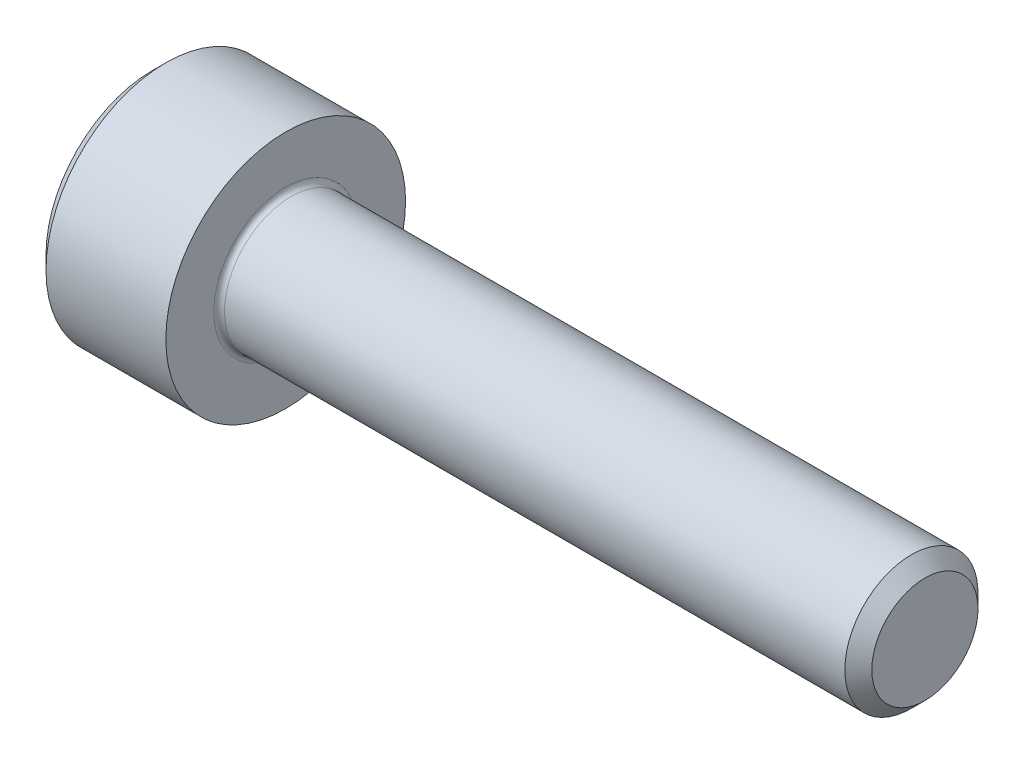
ISO-10303-21;
HEADER;
FILE_DESCRIPTION(('STEP AP214'),'2;1');
FILE_NAME('part.step','',(''),(''),'','','');
FILE_SCHEMA(('AUTOMOTIVE_DESIGN { 1 0 10303 214 1 1 1 1 }'));
ENDSEC;
DATA;
#1=APPLICATION_CONTEXT('core data for automotive mechanical design processes');
#2=APPLICATION_PROTOCOL_DEFINITION('international standard','automotive_design',2000,#1);
#3=PRODUCT_CONTEXT('',#1,'mechanical');
#4=PRODUCT('Part','Part','',(#3));
#5=PRODUCT_RELATED_PRODUCT_CATEGORY('part','',(#4));
#6=PRODUCT_DEFINITION_FORMATION('','',#4);
#7=PRODUCT_DEFINITION_CONTEXT('part definition',#1,'design');
#8=PRODUCT_DEFINITION('design','',#6,#7);
#9=PRODUCT_DEFINITION_SHAPE('','',#8);
#10=(LENGTH_UNIT() NAMED_UNIT(*) SI_UNIT(.MILLI.,.METRE.));
#11=(NAMED_UNIT(*) PLANE_ANGLE_UNIT() SI_UNIT($,.RADIAN.));
#12=(NAMED_UNIT(*) SI_UNIT($,.STERADIAN.) SOLID_ANGLE_UNIT());
#13=UNCERTAINTY_MEASURE_WITH_UNIT(LENGTH_MEASURE(1.E-05),#10,'distance_accuracy_value','');
#14=(GEOMETRIC_REPRESENTATION_CONTEXT(3) GLOBAL_UNCERTAINTY_ASSIGNED_CONTEXT((#13)) GLOBAL_UNIT_ASSIGNED_CONTEXT((#10,
#11,#12)) REPRESENTATION_CONTEXT('',''));
#15=CARTESIAN_POINT('',(0.,0.,0.));
#16=DIRECTION('',(0.,0.,1.));
#17=DIRECTION('',(1.,0.,0.));
#18=AXIS2_PLACEMENT_3D('',#15,#16,#17);
#19=CARTESIAN_POINT('',(0.,0.,0.));
#20=DIRECTION('',(-1.,0.,0.));
#21=DIRECTION('',(0.,0.,1.));
#22=AXIS2_PLACEMENT_3D('',#19,#20,#21);
#23=PLANE('',#22);
#24=DIRECTION('',(0.,-0.5,0.866025403784438));
#25=VECTOR('',#24,1.);
#26=CARTESIAN_POINT('',(0.,1.18068130049278,0.));
#27=LINE('',#26,#25);
#28=CARTESIAN_POINT('',(0.,1.18068130049278,0.));
#29=VERTEX_POINT('',#28);
#30=CARTESIAN_POINT('',(0.,0.590340650246392,1.0225));
#31=VERTEX_POINT('',#30);
#32=EDGE_CURVE('E430',#29,#31,#27,.T.);
#33=ORIENTED_EDGE('',*,*,#32,.T.);
#34=DIRECTION('',(0.,1.,0.));
#35=VECTOR('',#34,1.);
#36=CARTESIAN_POINT('',(0.,-0.590340650246393,1.0225));
#37=LINE('',#36,#35);
#38=CARTESIAN_POINT('',(0.,-0.590340650246393,1.0225));
#39=VERTEX_POINT('',#38);
#40=EDGE_CURVE('E137',#39,#31,#37,.T.);
#41=ORIENTED_EDGE('',*,*,#40,.F.);
#42=DIRECTION('',(0.,-0.500000000000001,-0.866025403784438));
#43=VECTOR('',#42,1.);
#44=CARTESIAN_POINT('',(0.,-0.590340650246393,1.0225));
#45=LINE('',#44,#43);
#46=CARTESIAN_POINT('',(0.,-1.18068130049279,0.));
#47=VERTEX_POINT('',#46);
#48=EDGE_CURVE('E433',#39,#47,#45,.T.);
#49=ORIENTED_EDGE('',*,*,#48,.T.);
#50=DIRECTION('',(0.,0.5,-0.866025403784439));
#51=VECTOR('',#50,1.);
#52=CARTESIAN_POINT('',(0.,-1.18068130049279,0.));
#53=LINE('',#52,#51);
#54=CARTESIAN_POINT('',(0.,-0.590340650246394,-1.0225));
#55=VERTEX_POINT('',#54);
#56=EDGE_CURVE('E436',#47,#55,#53,.T.);
#57=ORIENTED_EDGE('',*,*,#56,.T.);
#58=DIRECTION('',(0.,-1.,0.));
#59=VECTOR('',#58,1.);
#60=CARTESIAN_POINT('',(0.,0.590340650246391,-1.0225));
#61=LINE('',#60,#59);
#62=CARTESIAN_POINT('',(0.,0.590340650246391,-1.0225));
#63=VERTEX_POINT('',#62);
#64=EDGE_CURVE('E439',#63,#55,#61,.T.);
#65=ORIENTED_EDGE('',*,*,#64,.F.);
#66=DIRECTION('',(0.,-0.500000000000001,-0.866025403784438));
#67=VECTOR('',#66,1.);
#68=CARTESIAN_POINT('',(0.,1.18068130049278,0.));
#69=LINE('',#68,#67);
#70=EDGE_CURVE('E132',#29,#63,#69,.T.);
#71=ORIENTED_EDGE('',*,*,#70,.F.);
#72=EDGE_LOOP('',(#33,#41,#49,#57,#65,#71));
#73=FACE_BOUND('',#72,.T.);
#74=CARTESIAN_POINT('',(0.,0.,0.));
#75=DIRECTION('',(-1.,0.,0.));
#76=DIRECTION('',(0.,0.,1.));
#77=AXIS2_PLACEMENT_3D('',#74,#75,#76);
#78=CIRCLE('',#77,2.);
#79=CARTESIAN_POINT('',(0.,0.,2.));
#80=VERTEX_POINT('',#79);
#81=EDGE_CURVE('E148',#80,#80,#78,.T.);
#82=ORIENTED_EDGE('',*,*,#81,.T.);
#83=EDGE_LOOP('',(#82));
#84=FACE_BOUND('',#83,.T.);
#85=ADVANCED_FACE('F41',(#73,#84),#23,.T.);
#86=CARTESIAN_POINT('',(14.5,0.9965,0.));
#87=DIRECTION('',(1.,0.,0.));
#88=DIRECTION('',(0.,0.,-1.));
#89=AXIS2_PLACEMENT_3D('',#86,#87,#88);
#90=PLANE('',#89);
#91=CARTESIAN_POINT('',(14.5,0.,0.));
#92=DIRECTION('',(-1.,0.,0.));
#93=DIRECTION('',(0.,0.,1.));
#94=AXIS2_PLACEMENT_3D('',#91,#92,#93);
#95=CIRCLE('',#94,0.9965);
#96=CARTESIAN_POINT('',(14.5,0.,0.9965));
#97=VERTEX_POINT('',#96);
#98=EDGE_CURVE('E161',#97,#97,#95,.T.);
#99=ORIENTED_EDGE('',*,*,#98,.F.);
#100=EDGE_LOOP('',(#99));
#101=FACE_BOUND('',#100,.T.);
#102=ADVANCED_FACE('F182',(#101),#90,.T.);
#103=CARTESIAN_POINT('',(14.5,0.,0.));
#104=DIRECTION('',(-1.,0.,0.));
#105=DIRECTION('',(0.,0.,1.));
#106=AXIS2_PLACEMENT_3D('',#103,#104,#105);
#107=CONICAL_SURFACE('',#106,0.9965,0.785398163397469);
#108=CARTESIAN_POINT('',(14.2465,0.,0.));
#109=DIRECTION('',(-1.,0.,0.));
#110=DIRECTION('',(0.,0.,1.));
#111=AXIS2_PLACEMENT_3D('',#108,#109,#110);
#112=CIRCLE('',#111,1.25);
#113=CARTESIAN_POINT('',(14.2465,0.,1.25));
#114=VERTEX_POINT('',#113);
#115=EDGE_CURVE('E158',#114,#114,#112,.T.);
#116=ORIENTED_EDGE('',*,*,#115,.F.);
#117=EDGE_LOOP('',(#116));
#118=FACE_BOUND('',#117,.T.);
#119=ORIENTED_EDGE('',*,*,#98,.T.);
#120=EDGE_LOOP('',(#119));
#121=FACE_BOUND('',#120,.T.);
#122=ADVANCED_FACE('F188',(#118,#121),#107,.T.);
#123=CARTESIAN_POINT('',(-31.75,0.,0.));
#124=DIRECTION('',(-1.,0.,0.));
#125=DIRECTION('',(0.,0.,1.));
#126=AXIS2_PLACEMENT_3D('',#123,#124,#125);
#127=CYLINDRICAL_SURFACE('',#126,1.25);
#128=CARTESIAN_POINT('',(2.6,0.,0.));
#129=DIRECTION('',(1.,0.,0.));
#130=DIRECTION('',(0.,0.,-1.));
#131=AXIS2_PLACEMENT_3D('',#128,#129,#130);
#132=CIRCLE('',#131,1.25);
#133=CARTESIAN_POINT('',(2.6,0.,-1.25));
#134=VERTEX_POINT('',#133);
#135=EDGE_CURVE('E11',#134,#134,#132,.T.);
#136=ORIENTED_EDGE('',*,*,#135,.T.);
#137=EDGE_LOOP('',(#136));
#138=FACE_BOUND('',#137,.T.);
#139=ORIENTED_EDGE('',*,*,#115,.T.);
#140=EDGE_LOOP('',(#139));
#141=FACE_BOUND('',#140,.T.);
#142=ADVANCED_FACE('F199',(#138,#141),#127,.T.);
#143=CARTESIAN_POINT('',(2.5,2.25,0.));
#144=DIRECTION('',(1.,0.,0.));
#145=DIRECTION('',(0.,0.,-1.));
#146=AXIS2_PLACEMENT_3D('',#143,#144,#145);
#147=PLANE('',#146);
#148=CARTESIAN_POINT('',(2.5,0.,0.));
#149=DIRECTION('',(1.,0.,0.));
#150=DIRECTION('',(0.,0.,-1.));
#151=AXIS2_PLACEMENT_3D('',#148,#149,#150);
#152=CIRCLE('',#151,1.35);
#153=CARTESIAN_POINT('',(2.5,0.,-1.35));
#154=VERTEX_POINT('',#153);
#155=EDGE_CURVE('E49',#154,#154,#152,.F.);
#156=ORIENTED_EDGE('',*,*,#155,.T.);
#157=EDGE_LOOP('',(#156));
#158=FACE_BOUND('',#157,.T.);
#159=CARTESIAN_POINT('',(2.5,0.,0.));
#160=DIRECTION('',(-1.,0.,0.));
#161=DIRECTION('',(0.,0.,1.));
#162=AXIS2_PLACEMENT_3D('',#159,#160,#161);
#163=CIRCLE('',#162,2.25);
#164=CARTESIAN_POINT('',(2.5,0.,2.25));
#165=VERTEX_POINT('',#164);
#166=EDGE_CURVE('E155',#165,#165,#163,.T.);
#167=ORIENTED_EDGE('',*,*,#166,.F.);
#168=EDGE_LOOP('',(#167));
#169=FACE_BOUND('',#168,.T.);
#170=ADVANCED_FACE('F166',(#158,#169),#147,.T.);
#171=CARTESIAN_POINT('',(-31.75,0.,0.));
#172=DIRECTION('',(-1.,0.,0.));
#173=DIRECTION('',(0.,0.,1.));
#174=AXIS2_PLACEMENT_3D('',#171,#172,#173);
#175=CYLINDRICAL_SURFACE('',#174,2.25);
#176=ORIENTED_EDGE('',*,*,#166,.T.);
#177=EDGE_LOOP('',(#176));
#178=FACE_BOUND('',#177,.T.);
#179=CARTESIAN_POINT('',(0.25,0.,0.));
#180=DIRECTION('',(-1.,0.,0.));
#181=DIRECTION('',(0.,0.,1.));
#182=AXIS2_PLACEMENT_3D('',#179,#180,#181);
#183=CIRCLE('',#182,2.25);
#184=CARTESIAN_POINT('',(0.25,0.,2.25));
#185=VERTEX_POINT('',#184);
#186=EDGE_CURVE('E152',#185,#185,#183,.T.);
#187=ORIENTED_EDGE('',*,*,#186,.F.);
#188=EDGE_LOOP('',(#187));
#189=FACE_BOUND('',#188,.T.);
#190=ADVANCED_FACE('F177',(#178,#189),#175,.T.);
#191=CARTESIAN_POINT('',(0.,0.,0.));
#192=DIRECTION('',(1.,0.,0.));
#193=DIRECTION('',(0.,0.,-1.));
#194=AXIS2_PLACEMENT_3D('',#191,#192,#193);
#195=CONICAL_SURFACE('',#194,2.,0.785398163397442);
#196=ORIENTED_EDGE('',*,*,#186,.T.);
#197=EDGE_LOOP('',(#196));
#198=FACE_BOUND('',#197,.T.);
#199=ORIENTED_EDGE('',*,*,#81,.F.);
#200=EDGE_LOOP('',(#199));
#201=FACE_BOUND('',#200,.T.);
#202=ADVANCED_FACE('F170',(#198,#201),#195,.T.);
#203=CARTESIAN_POINT('',(2.6,0.,0.));
#204=DIRECTION('',(1.,0.,0.));
#205=DIRECTION('',(0.,0.,-1.));
#206=AXIS2_PLACEMENT_3D('',#203,#204,#205);
#207=TOROIDAL_SURFACE('',#206,1.35,0.1);
#208=ORIENTED_EDGE('',*,*,#135,.F.);
#209=EDGE_LOOP('',(#208));
#210=FACE_BOUND('',#209,.T.);
#211=ORIENTED_EDGE('',*,*,#155,.F.);
#212=EDGE_LOOP('',(#211));
#213=FACE_BOUND('',#212,.T.);
#214=ADVANCED_FACE('F43',(#210,#213),#207,.F.);
#215=CARTESIAN_POINT('',(1.1,1.18068130049278,0.));
#216=DIRECTION('',(0.,-0.866025403784439,-0.5));
#217=DIRECTION('',(0.,0.5,-0.866025403784439));
#218=AXIS2_PLACEMENT_3D('',#215,#216,#217);
#219=PLANE('',#218);
#220=ORIENTED_EDGE('',*,*,#32,.F.);
#221=DIRECTION('',(-1.,0.,0.));
#222=VECTOR('',#221,1.);
#223=CARTESIAN_POINT('',(1.1,1.18068130049278,0.));
#224=LINE('',#223,#222);
#225=CARTESIAN_POINT('',(1.1,1.18068130049278,0.));
#226=VERTEX_POINT('',#225);
#227=EDGE_CURVE('E420',#226,#29,#224,.T.);
#228=ORIENTED_EDGE('',*,*,#227,.F.);
#229=DIRECTION('',(0.,-0.5,0.866025403784438));
#230=VECTOR('',#229,1.);
#231=CARTESIAN_POINT('',(1.1,1.18068130049278,0.));
#232=LINE('',#231,#230);
#233=CARTESIAN_POINT('',(1.1,0.885510975369588,0.51125));
#234=VERTEX_POINT('',#233);
#235=EDGE_CURVE('E124',#226,#234,#232,.T.);
#236=ORIENTED_EDGE('',*,*,#235,.T.);
#237=CARTESIAN_POINT('',(1.1,0.590340650246392,1.0225));
#238=VERTEX_POINT('',#237);
#239=EDGE_CURVE('E115',#234,#238,#232,.T.);
#240=ORIENTED_EDGE('',*,*,#239,.T.);
#241=DIRECTION('',(-1.,0.,0.));
#242=VECTOR('',#241,1.);
#243=CARTESIAN_POINT('',(1.1,0.590340650246392,1.0225));
#244=LINE('',#243,#242);
#245=EDGE_CURVE('E129',#238,#31,#244,.T.);
#246=ORIENTED_EDGE('',*,*,#245,.T.);
#247=EDGE_LOOP('',(#220,#228,#236,#240,#246));
#248=FACE_BOUND('',#247,.T.);
#249=ADVANCED_FACE('F128',(#248),#219,.T.);
#250=CARTESIAN_POINT('',(1.1,-0.590340650246393,1.0225));
#251=DIRECTION('',(0.,0.,1.));
#252=DIRECTION('',(0.,-1.,0.));
#253=AXIS2_PLACEMENT_3D('',#250,#251,#252);
#254=PLANE('',#253);
#255=ORIENTED_EDGE('',*,*,#40,.T.);
#256=ORIENTED_EDGE('',*,*,#245,.F.);
#257=DIRECTION('',(0.,1.,0.));
#258=VECTOR('',#257,1.);
#259=CARTESIAN_POINT('',(1.1,-0.590340650246393,1.0225));
#260=LINE('',#259,#258);
#261=CARTESIAN_POINT('',(1.1,0.,1.0225));
#262=VERTEX_POINT('',#261);
#263=EDGE_CURVE('E112',#262,#238,#260,.T.);
#264=ORIENTED_EDGE('',*,*,#263,.F.);
#265=CARTESIAN_POINT('',(1.1,-0.590340650246393,1.0225));
#266=VERTEX_POINT('',#265);
#267=EDGE_CURVE('E123',#266,#262,#260,.T.);
#268=ORIENTED_EDGE('',*,*,#267,.F.);
#269=DIRECTION('',(-1.,0.,0.));
#270=VECTOR('',#269,1.);
#271=CARTESIAN_POINT('',(1.1,-0.590340650246393,1.0225));
#272=LINE('',#271,#270);
#273=EDGE_CURVE('E139',#266,#39,#272,.T.);
#274=ORIENTED_EDGE('',*,*,#273,.T.);
#275=EDGE_LOOP('',(#255,#256,#264,#268,#274));
#276=FACE_BOUND('',#275,.T.);
#277=ADVANCED_FACE('F134',(#276),#254,.F.);
#278=CARTESIAN_POINT('',(1.1,-0.590340650246393,1.0225));
#279=DIRECTION('',(0.,0.866025403784438,-0.500000000000001));
#280=DIRECTION('',(0.,0.500000000000001,0.866025403784438));
#281=AXIS2_PLACEMENT_3D('',#278,#279,#280);
#282=PLANE('',#281);
#283=ORIENTED_EDGE('',*,*,#48,.F.);
#284=ORIENTED_EDGE('',*,*,#273,.F.);
#285=DIRECTION('',(0.,-0.500000000000001,-0.866025403784438));
#286=VECTOR('',#285,1.);
#287=CARTESIAN_POINT('',(1.1,-0.590340650246393,1.0225));
#288=LINE('',#287,#286);
#289=CARTESIAN_POINT('',(1.1,-0.885510975369589,0.511250000000001));
#290=VERTEX_POINT('',#289);
#291=EDGE_CURVE('E459',#266,#290,#288,.T.);
#292=ORIENTED_EDGE('',*,*,#291,.T.);
#293=CARTESIAN_POINT('',(1.1,-1.18068130049279,0.));
#294=VERTEX_POINT('',#293);
#295=EDGE_CURVE('E448',#290,#294,#288,.T.);
#296=ORIENTED_EDGE('',*,*,#295,.T.);
#297=DIRECTION('',(-1.,0.,0.));
#298=VECTOR('',#297,1.);
#299=CARTESIAN_POINT('',(1.1,-1.18068130049279,0.));
#300=LINE('',#299,#298);
#301=EDGE_CURVE('E144',#294,#47,#300,.T.);
#302=ORIENTED_EDGE('',*,*,#301,.T.);
#303=EDGE_LOOP('',(#283,#284,#292,#296,#302));
#304=FACE_BOUND('',#303,.T.);
#305=ADVANCED_FACE('F285',(#304),#282,.T.);
#306=CARTESIAN_POINT('',(1.1,-1.18068130049279,0.));
#307=DIRECTION('',(0.,0.866025403784439,0.5));
#308=DIRECTION('',(0.,-0.5,0.866025403784439));
#309=AXIS2_PLACEMENT_3D('',#306,#307,#308);
#310=PLANE('',#309);
#311=ORIENTED_EDGE('',*,*,#56,.F.);
#312=ORIENTED_EDGE('',*,*,#301,.F.);
#313=DIRECTION('',(0.,0.5,-0.866025403784439));
#314=VECTOR('',#313,1.);
#315=CARTESIAN_POINT('',(1.1,-1.18068130049279,0.));
#316=LINE('',#315,#314);
#317=CARTESIAN_POINT('',(1.1,-0.88551097536959,-0.511250000000001));
#318=VERTEX_POINT('',#317);
#319=EDGE_CURVE('E426',#294,#318,#316,.T.);
#320=ORIENTED_EDGE('',*,*,#319,.T.);
#321=CARTESIAN_POINT('',(1.1,-0.590340650246394,-1.0225));
#322=VERTEX_POINT('',#321);
#323=EDGE_CURVE('E458',#318,#322,#316,.T.);
#324=ORIENTED_EDGE('',*,*,#323,.T.);
#325=DIRECTION('',(-1.,0.,0.));
#326=VECTOR('',#325,1.);
#327=CARTESIAN_POINT('',(1.1,-0.590340650246394,-1.0225));
#328=LINE('',#327,#326);
#329=EDGE_CURVE('E419',#322,#55,#328,.T.);
#330=ORIENTED_EDGE('',*,*,#329,.T.);
#331=EDGE_LOOP('',(#311,#312,#320,#324,#330));
#332=FACE_BOUND('',#331,.T.);
#333=ADVANCED_FACE('F294',(#332),#310,.T.);
#334=CARTESIAN_POINT('',(1.1,0.590340650246391,-1.0225));
#335=DIRECTION('',(0.,0.,-1.));
#336=DIRECTION('',(0.,1.,0.));
#337=AXIS2_PLACEMENT_3D('',#334,#335,#336);
#338=PLANE('',#337);
#339=ORIENTED_EDGE('',*,*,#64,.T.);
#340=ORIENTED_EDGE('',*,*,#329,.F.);
#341=DIRECTION('',(0.,-1.,0.));
#342=VECTOR('',#341,1.);
#343=CARTESIAN_POINT('',(1.1,0.590340650246391,-1.0225));
#344=LINE('',#343,#342);
#345=CARTESIAN_POINT('',(1.1,0.,-1.0225));
#346=VERTEX_POINT('',#345);
#347=EDGE_CURVE('E423',#346,#322,#344,.T.);
#348=ORIENTED_EDGE('',*,*,#347,.F.);
#349=CARTESIAN_POINT('',(1.1,0.590340650246391,-1.0225));
#350=VERTEX_POINT('',#349);
#351=EDGE_CURVE('E56',#350,#346,#344,.T.);
#352=ORIENTED_EDGE('',*,*,#351,.F.);
#353=DIRECTION('',(-1.,0.,0.));
#354=VECTOR('',#353,1.);
#355=CARTESIAN_POINT('',(1.1,0.590340650246391,-1.0225));
#356=LINE('',#355,#354);
#357=EDGE_CURVE('E416',#350,#63,#356,.T.);
#358=ORIENTED_EDGE('',*,*,#357,.T.);
#359=EDGE_LOOP('',(#339,#340,#348,#352,#358));
#360=FACE_BOUND('',#359,.T.);
#361=ADVANCED_FACE('F304',(#360),#338,.F.);
#362=CARTESIAN_POINT('',(1.1,1.18068130049278,0.));
#363=DIRECTION('',(0.,0.866025403784438,-0.500000000000001));
#364=DIRECTION('',(0.,0.500000000000001,0.866025403784438));
#365=AXIS2_PLACEMENT_3D('',#362,#363,#364);
#366=PLANE('',#365);
#367=ORIENTED_EDGE('',*,*,#70,.T.);
#368=ORIENTED_EDGE('',*,*,#357,.F.);
#369=DIRECTION('',(0.,-0.500000000000001,-0.866025403784438));
#370=VECTOR('',#369,1.);
#371=CARTESIAN_POINT('',(1.1,1.18068130049278,0.));
#372=LINE('',#371,#370);
#373=CARTESIAN_POINT('',(1.1,0.885510975369588,-0.511250000000001));
#374=VERTEX_POINT('',#373);
#375=EDGE_CURVE('E406',#374,#350,#372,.T.);
#376=ORIENTED_EDGE('',*,*,#375,.F.);
#377=EDGE_CURVE('E412',#226,#374,#372,.T.);
#378=ORIENTED_EDGE('',*,*,#377,.F.);
#379=ORIENTED_EDGE('',*,*,#227,.T.);
#380=EDGE_LOOP('',(#367,#368,#376,#378,#379));
#381=FACE_BOUND('',#380,.T.);
#382=ADVANCED_FACE('F314',(#381),#366,.F.);
#383=CARTESIAN_POINT('',(1.1,0.,2.045));
#384=DIRECTION('',(1.,0.,0.));
#385=DIRECTION('',(0.,0.,-1.));
#386=AXIS2_PLACEMENT_3D('',#383,#384,#385);
#387=PLANE('',#386);
#388=ORIENTED_EDGE('',*,*,#347,.T.);
#389=ORIENTED_EDGE('',*,*,#323,.F.);
#390=CARTESIAN_POINT('',(1.1,0.,0.));
#391=DIRECTION('',(-1.,0.,0.));
#392=DIRECTION('',(0.,0.,1.));
#393=AXIS2_PLACEMENT_3D('',#390,#391,#392);
#394=CIRCLE('',#393,1.0225);
#395=EDGE_CURVE('E454',#346,#318,#394,.T.);
#396=ORIENTED_EDGE('',*,*,#395,.F.);
#397=EDGE_LOOP('',(#388,#389,#396));
#398=FACE_BOUND('',#397,.T.);
#399=ADVANCED_FACE('F324',(#398),#387,.F.);
#400=ORIENTED_EDGE('',*,*,#319,.F.);
#401=ORIENTED_EDGE('',*,*,#295,.F.);
#402=EDGE_CURVE('E142',#318,#290,#394,.T.);
#403=ORIENTED_EDGE('',*,*,#402,.F.);
#404=EDGE_LOOP('',(#400,#401,#403));
#405=FACE_BOUND('',#404,.T.);
#406=ADVANCED_FACE('F334',(#405),#387,.F.);
#407=ORIENTED_EDGE('',*,*,#291,.F.);
#408=ORIENTED_EDGE('',*,*,#267,.T.);
#409=EDGE_CURVE('E138',#290,#262,#394,.T.);
#410=ORIENTED_EDGE('',*,*,#409,.F.);
#411=EDGE_LOOP('',(#407,#408,#410));
#412=FACE_BOUND('',#411,.T.);
#413=ADVANCED_FACE('F344',(#412),#387,.F.);
#414=ORIENTED_EDGE('',*,*,#263,.T.);
#415=ORIENTED_EDGE('',*,*,#239,.F.);
#416=EDGE_CURVE('E118',#262,#234,#394,.T.);
#417=ORIENTED_EDGE('',*,*,#416,.F.);
#418=EDGE_LOOP('',(#414,#415,#417));
#419=FACE_BOUND('',#418,.T.);
#420=ADVANCED_FACE('F114',(#419),#387,.F.);
#421=ORIENTED_EDGE('',*,*,#235,.F.);
#422=ORIENTED_EDGE('',*,*,#377,.T.);
#423=EDGE_CURVE('E149',#234,#374,#394,.T.);
#424=ORIENTED_EDGE('',*,*,#423,.F.);
#425=EDGE_LOOP('',(#421,#422,#424));
#426=FACE_BOUND('',#425,.T.);
#427=ADVANCED_FACE('F361',(#426),#387,.F.);
#428=ORIENTED_EDGE('',*,*,#375,.T.);
#429=ORIENTED_EDGE('',*,*,#351,.T.);
#430=EDGE_CURVE('E409',#374,#346,#394,.T.);
#431=ORIENTED_EDGE('',*,*,#430,.F.);
#432=EDGE_LOOP('',(#428,#429,#431));
#433=FACE_BOUND('',#432,.T.);
#434=ADVANCED_FACE('F265',(#433),#387,.F.);
#435=CARTESIAN_POINT('',(1.1,0.,0.));
#436=DIRECTION('',(-1.,0.,0.));
#437=DIRECTION('',(0.,0.,1.));
#438=AXIS2_PLACEMENT_3D('',#435,#436,#437);
#439=CONICAL_SURFACE('',#438,1.0225,1.04719755119659);
#440=CARTESIAN_POINT('',(1.6903406502464,0.,0.));
#441=VERTEX_POINT('',#440);
#442=VERTEX_LOOP('',#441);
#443=FACE_BOUND('',#442,.T.);
#444=ORIENTED_EDGE('',*,*,#416,.T.);
#445=ORIENTED_EDGE('',*,*,#423,.T.);
#446=ORIENTED_EDGE('',*,*,#430,.T.);
#447=ORIENTED_EDGE('',*,*,#395,.T.);
#448=ORIENTED_EDGE('',*,*,#402,.T.);
#449=ORIENTED_EDGE('',*,*,#409,.T.);
#450=EDGE_LOOP('',(#444,#445,#446,#447,#448,#449));
#451=FACE_BOUND('',#450,.T.);
#452=ADVANCED_FACE('F192',(#443,#451),#439,.F.);
#453=CLOSED_SHELL('',(#85,#102,#122,#142,#170,#190,#202,#214,#249,#277,#305,#333,#361,#382,#399,
#406,#413,#420,#427,#434,#452));
#454=MANIFOLD_SOLID_BREP('B2',#453);
#455=ADVANCED_BREP_SHAPE_REPRESENTATION('',(#18,#454),#14);
#456=SHAPE_DEFINITION_REPRESENTATION(#9,#455);
ENDSEC;
END-ISO-10303-21;
